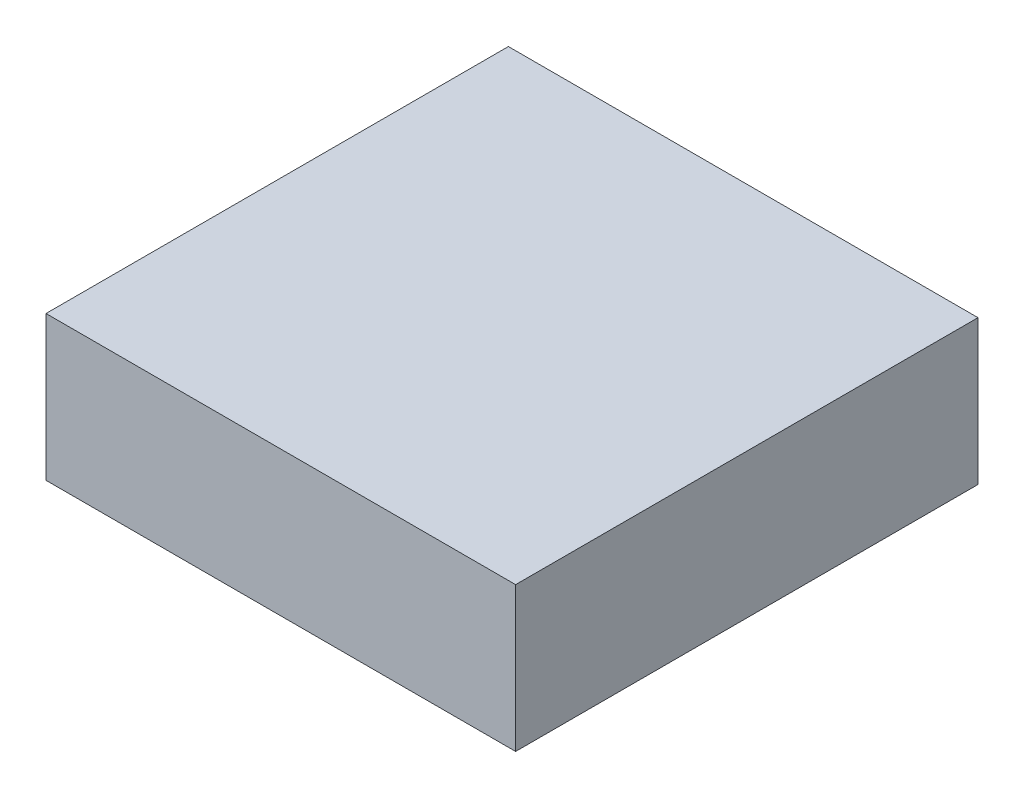
ISO-10303-21;
HEADER;
FILE_DESCRIPTION(('STEP AP214'),'2;1');
FILE_NAME('part.step','',(''),(''),'','','');
FILE_SCHEMA(('AUTOMOTIVE_DESIGN { 1 0 10303 214 1 1 1 1 }'));
ENDSEC;
DATA;
#1=APPLICATION_CONTEXT('core data for automotive mechanical design processes');
#2=APPLICATION_PROTOCOL_DEFINITION('international standard','automotive_design',2000,#1);
#3=PRODUCT_CONTEXT('',#1,'mechanical');
#4=PRODUCT('Part','Part','',(#3));
#5=PRODUCT_RELATED_PRODUCT_CATEGORY('part','',(#4));
#6=PRODUCT_DEFINITION_FORMATION('','',#4);
#7=PRODUCT_DEFINITION_CONTEXT('part definition',#1,'design');
#8=PRODUCT_DEFINITION('design','',#6,#7);
#9=PRODUCT_DEFINITION_SHAPE('','',#8);
#10=(LENGTH_UNIT() NAMED_UNIT(*) SI_UNIT(.MILLI.,.METRE.));
#11=(NAMED_UNIT(*) PLANE_ANGLE_UNIT() SI_UNIT($,.RADIAN.));
#12=(NAMED_UNIT(*) SI_UNIT($,.STERADIAN.) SOLID_ANGLE_UNIT());
#13=UNCERTAINTY_MEASURE_WITH_UNIT(LENGTH_MEASURE(1.E-05),#10,'distance_accuracy_value','');
#14=(GEOMETRIC_REPRESENTATION_CONTEXT(3) GLOBAL_UNCERTAINTY_ASSIGNED_CONTEXT((#13)) GLOBAL_UNIT_ASSIGNED_CONTEXT((#10,
#11,#12)) REPRESENTATION_CONTEXT('',''));
#15=CARTESIAN_POINT('',(0.,0.,0.));
#16=DIRECTION('',(0.,0.,1.));
#17=DIRECTION('',(1.,0.,0.));
#18=AXIS2_PLACEMENT_3D('',#15,#16,#17);
#19=CARTESIAN_POINT('',(32.5,20.,32.));
#20=DIRECTION('',(-1.,0.,0.));
#21=DIRECTION('',(0.,0.,1.));
#22=AXIS2_PLACEMENT_3D('',#19,#20,#21);
#23=PLANE('',#22);
#24=DIRECTION('',(0.,0.,-1.));
#25=VECTOR('',#24,1.);
#26=CARTESIAN_POINT('',(32.5,0.,32.));
#27=LINE('',#26,#25);
#28=CARTESIAN_POINT('',(32.5,0.,32.));
#29=VERTEX_POINT('',#28);
#30=CARTESIAN_POINT('',(32.5,0.,-32.));
#31=VERTEX_POINT('',#30);
#32=EDGE_CURVE('E96',#29,#31,#27,.T.);
#33=ORIENTED_EDGE('',*,*,#32,.T.);
#34=DIRECTION('',(0.,-1.,0.));
#35=VECTOR('',#34,1.);
#36=CARTESIAN_POINT('',(32.5,20.,-32.));
#37=LINE('',#36,#35);
#38=CARTESIAN_POINT('',(32.5,20.,-32.));
#39=VERTEX_POINT('',#38);
#40=EDGE_CURVE('E11',#39,#31,#37,.T.);
#41=ORIENTED_EDGE('',*,*,#40,.F.);
#42=DIRECTION('',(0.,0.,-1.));
#43=VECTOR('',#42,1.);
#44=CARTESIAN_POINT('',(32.5,20.,32.));
#45=LINE('',#44,#43);
#46=CARTESIAN_POINT('',(32.5,20.,32.));
#47=VERTEX_POINT('',#46);
#48=EDGE_CURVE('E84',#47,#39,#45,.T.);
#49=ORIENTED_EDGE('',*,*,#48,.F.);
#50=DIRECTION('',(0.,-1.,0.));
#51=VECTOR('',#50,1.);
#52=CARTESIAN_POINT('',(32.5,20.,32.));
#53=LINE('',#52,#51);
#54=EDGE_CURVE('E92',#47,#29,#53,.T.);
#55=ORIENTED_EDGE('',*,*,#54,.T.);
#56=EDGE_LOOP('',(#33,#41,#49,#55));
#57=FACE_BOUND('',#56,.T.);
#58=ADVANCED_FACE('F33',(#57),#23,.F.);
#59=CARTESIAN_POINT('',(-32.5,20.,-32.));
#60=DIRECTION('',(0.,0.,1.));
#61=DIRECTION('',(1.,0.,0.));
#62=AXIS2_PLACEMENT_3D('',#59,#60,#61);
#63=PLANE('',#62);
#64=DIRECTION('',(-1.,0.,0.));
#65=VECTOR('',#64,1.);
#66=CARTESIAN_POINT('',(-32.5,0.,-32.));
#67=LINE('',#66,#65);
#68=CARTESIAN_POINT('',(-32.5,0.,-32.));
#69=VERTEX_POINT('',#68);
#70=EDGE_CURVE('E88',#31,#69,#67,.T.);
#71=ORIENTED_EDGE('',*,*,#70,.T.);
#72=DIRECTION('',(0.,-1.,0.));
#73=VECTOR('',#72,1.);
#74=CARTESIAN_POINT('',(-32.5,20.,-32.));
#75=LINE('',#74,#73);
#76=CARTESIAN_POINT('',(-32.5,20.,-32.));
#77=VERTEX_POINT('',#76);
#78=EDGE_CURVE('E41',#77,#69,#75,.T.);
#79=ORIENTED_EDGE('',*,*,#78,.F.);
#80=DIRECTION('',(-1.,0.,0.));
#81=VECTOR('',#80,1.);
#82=CARTESIAN_POINT('',(-32.5,20.,-32.));
#83=LINE('',#82,#81);
#84=EDGE_CURVE('E79',#39,#77,#83,.T.);
#85=ORIENTED_EDGE('',*,*,#84,.F.);
#86=ORIENTED_EDGE('',*,*,#40,.T.);
#87=EDGE_LOOP('',(#71,#79,#85,#86));
#88=FACE_BOUND('',#87,.T.);
#89=ADVANCED_FACE('F87',(#88),#63,.F.);
#90=CARTESIAN_POINT('',(-32.5,20.,32.));
#91=DIRECTION('',(1.,0.,0.));
#92=DIRECTION('',(0.,0.,-1.));
#93=AXIS2_PLACEMENT_3D('',#90,#91,#92);
#94=PLANE('',#93);
#95=DIRECTION('',(0.,0.,1.));
#96=VECTOR('',#95,1.);
#97=CARTESIAN_POINT('',(-32.5,0.,32.));
#98=LINE('',#97,#96);
#99=CARTESIAN_POINT('',(-32.5,0.,32.));
#100=VERTEX_POINT('',#99);
#101=EDGE_CURVE('E66',#69,#100,#98,.T.);
#102=ORIENTED_EDGE('',*,*,#101,.T.);
#103=DIRECTION('',(0.,-1.,0.));
#104=VECTOR('',#103,1.);
#105=CARTESIAN_POINT('',(-32.5,20.,32.));
#106=LINE('',#105,#104);
#107=CARTESIAN_POINT('',(-32.5,20.,32.));
#108=VERTEX_POINT('',#107);
#109=EDGE_CURVE('E89',#108,#100,#106,.T.);
#110=ORIENTED_EDGE('',*,*,#109,.F.);
#111=DIRECTION('',(0.,0.,1.));
#112=VECTOR('',#111,1.);
#113=CARTESIAN_POINT('',(-32.5,20.,32.));
#114=LINE('',#113,#112);
#115=EDGE_CURVE('E82',#77,#108,#114,.T.);
#116=ORIENTED_EDGE('',*,*,#115,.F.);
#117=ORIENTED_EDGE('',*,*,#78,.T.);
#118=EDGE_LOOP('',(#102,#110,#116,#117));
#119=FACE_BOUND('',#118,.T.);
#120=ADVANCED_FACE('F90',(#119),#94,.F.);
#121=CARTESIAN_POINT('',(-32.5,20.,32.));
#122=DIRECTION('',(0.,0.,-1.));
#123=DIRECTION('',(-1.,0.,0.));
#124=AXIS2_PLACEMENT_3D('',#121,#122,#123);
#125=PLANE('',#124);
#126=DIRECTION('',(1.,0.,0.));
#127=VECTOR('',#126,1.);
#128=CARTESIAN_POINT('',(-32.5,0.,32.));
#129=LINE('',#128,#127);
#130=EDGE_CURVE('E72',#100,#29,#129,.T.);
#131=ORIENTED_EDGE('',*,*,#130,.T.);
#132=ORIENTED_EDGE('',*,*,#54,.F.);
#133=DIRECTION('',(1.,0.,0.));
#134=VECTOR('',#133,1.);
#135=CARTESIAN_POINT('',(-32.5,20.,32.));
#136=LINE('',#135,#134);
#137=EDGE_CURVE('E49',#108,#47,#136,.T.);
#138=ORIENTED_EDGE('',*,*,#137,.F.);
#139=ORIENTED_EDGE('',*,*,#109,.T.);
#140=EDGE_LOOP('',(#131,#132,#138,#139));
#141=FACE_BOUND('',#140,.T.);
#142=ADVANCED_FACE('F103',(#141),#125,.F.);
#143=CARTESIAN_POINT('',(0.,20.,0.));
#144=DIRECTION('',(0.,-1.,0.));
#145=DIRECTION('',(0.,0.,-1.));
#146=AXIS2_PLACEMENT_3D('',#143,#144,#145);
#147=PLANE('',#146);
#148=ORIENTED_EDGE('',*,*,#48,.T.);
#149=ORIENTED_EDGE('',*,*,#84,.T.);
#150=ORIENTED_EDGE('',*,*,#115,.T.);
#151=ORIENTED_EDGE('',*,*,#137,.T.);
#152=EDGE_LOOP('',(#148,#149,#150,#151));
#153=FACE_BOUND('',#152,.T.);
#154=ADVANCED_FACE('F80',(#153),#147,.F.);
#155=CARTESIAN_POINT('',(0.,0.,0.));
#156=DIRECTION('',(0.,-1.,0.));
#157=DIRECTION('',(0.,0.,-1.));
#158=AXIS2_PLACEMENT_3D('',#155,#156,#157);
#159=PLANE('',#158);
#160=ORIENTED_EDGE('',*,*,#32,.F.);
#161=ORIENTED_EDGE('',*,*,#130,.F.);
#162=ORIENTED_EDGE('',*,*,#101,.F.);
#163=ORIENTED_EDGE('',*,*,#70,.F.);
#164=EDGE_LOOP('',(#160,#161,#162,#163));
#165=FACE_BOUND('',#164,.T.);
#166=ADVANCED_FACE('F106',(#165),#159,.T.);
#167=CLOSED_SHELL('',(#58,#89,#120,#142,#154,#166));
#168=MANIFOLD_SOLID_BREP('B2',#167);
#169=ADVANCED_BREP_SHAPE_REPRESENTATION('',(#18,#168),#14);
#170=SHAPE_DEFINITION_REPRESENTATION(#9,#169);
ENDSEC;
END-ISO-10303-21;
